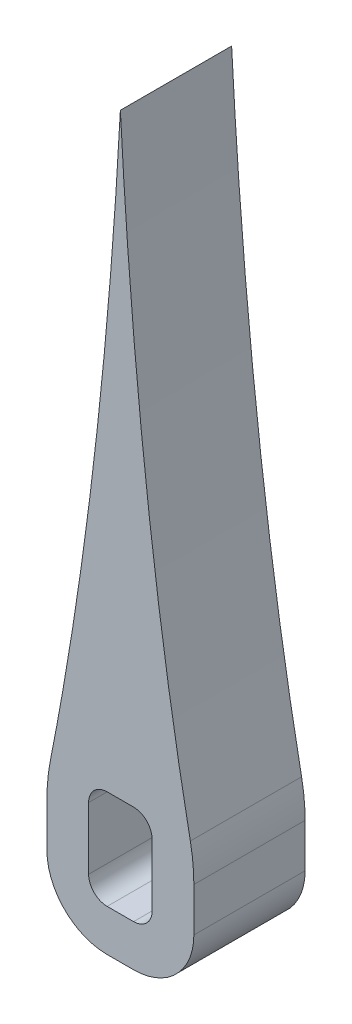
ISO-10303-21;
HEADER;
FILE_DESCRIPTION(('STEP AP214'),'2;1');
FILE_NAME('part.step','',(''),(''),'','','');
FILE_SCHEMA(('AUTOMOTIVE_DESIGN { 1 0 10303 214 1 1 1 1 }'));
ENDSEC;
DATA;
#1=APPLICATION_CONTEXT('core data for automotive mechanical design processes');
#2=APPLICATION_PROTOCOL_DEFINITION('international standard','automotive_design',2000,#1);
#3=PRODUCT_CONTEXT('',#1,'mechanical');
#4=PRODUCT('Part','Part','',(#3));
#5=PRODUCT_RELATED_PRODUCT_CATEGORY('part','',(#4));
#6=PRODUCT_DEFINITION_FORMATION('','',#4);
#7=PRODUCT_DEFINITION_CONTEXT('part definition',#1,'design');
#8=PRODUCT_DEFINITION('design','',#6,#7);
#9=PRODUCT_DEFINITION_SHAPE('','',#8);
#10=(LENGTH_UNIT() NAMED_UNIT(*) SI_UNIT(.MILLI.,.METRE.));
#11=(NAMED_UNIT(*) PLANE_ANGLE_UNIT() SI_UNIT($,.RADIAN.));
#12=(NAMED_UNIT(*) SI_UNIT($,.STERADIAN.) SOLID_ANGLE_UNIT());
#13=UNCERTAINTY_MEASURE_WITH_UNIT(LENGTH_MEASURE(1.E-05),#10,'distance_accuracy_value','');
#14=(GEOMETRIC_REPRESENTATION_CONTEXT(3) GLOBAL_UNCERTAINTY_ASSIGNED_CONTEXT((#13)) GLOBAL_UNIT_ASSIGNED_CONTEXT((#10,
#11,#12)) REPRESENTATION_CONTEXT('',''));
#15=CARTESIAN_POINT('',(0.,0.,0.));
#16=DIRECTION('',(0.,0.,1.));
#17=DIRECTION('',(1.,0.,0.));
#18=AXIS2_PLACEMENT_3D('',#15,#16,#17);
#19=CARTESIAN_POINT('',(-0.7239,-1.7018,6.096));
#20=DIRECTION('',(0.,0.,1.));
#21=DIRECTION('',(1.,0.,0.));
#22=AXIS2_PLACEMENT_3D('',#19,#20,#21);
#23=PLANE('',#22);
#24=CARTESIAN_POINT('',(-0.7239,-1.7018,6.096));
#25=DIRECTION('',(0.,0.,1.));
#26=DIRECTION('',(1.,0.,0.));
#27=AXIS2_PLACEMENT_3D('',#24,#25,#26);
#28=CIRCLE('',#27,3.302);
#29=CARTESIAN_POINT('',(-4.0259,-1.70179999999999,6.096));
#30=VERTEX_POINT('',#29);
#31=CARTESIAN_POINT('',(-0.723899999999977,-5.0038,6.096));
#32=VERTEX_POINT('',#31);
#33=EDGE_CURVE('E217',#30,#32,#28,.T.);
#34=ORIENTED_EDGE('',*,*,#33,.T.);
#35=DIRECTION('',(1.,0.,0.));
#36=VECTOR('',#35,1.);
#37=CARTESIAN_POINT('',(-0.723899999999977,-5.0038,6.096));
#38=LINE('',#37,#36);
#39=CARTESIAN_POINT('',(0.723899999999994,-5.0038,6.096));
#40=VERTEX_POINT('',#39);
#41=EDGE_CURVE('E220',#32,#40,#38,.T.);
#42=ORIENTED_EDGE('',*,*,#41,.T.);
#43=CARTESIAN_POINT('',(0.7239,-1.7018,6.096));
#44=DIRECTION('',(0.,0.,1.));
#45=DIRECTION('',(1.,0.,0.));
#46=AXIS2_PLACEMENT_3D('',#43,#44,#45);
#47=CIRCLE('',#46,3.302);
#48=CARTESIAN_POINT('',(4.0259,-1.70179999999998,6.096));
#49=VERTEX_POINT('',#48);
#50=EDGE_CURVE('E223',#40,#49,#47,.T.);
#51=ORIENTED_EDGE('',*,*,#50,.T.);
#52=DIRECTION('',(0.,1.,0.));
#53=VECTOR('',#52,1.);
#54=CARTESIAN_POINT('',(4.0259,0.692415094850239,6.096));
#55=LINE('',#54,#53);
#56=CARTESIAN_POINT('',(4.0259,0.692415094850239,6.096));
#57=VERTEX_POINT('',#56);
#58=EDGE_CURVE('E225',#49,#57,#55,.T.);
#59=ORIENTED_EDGE('',*,*,#58,.T.);
#60=CARTESIAN_POINT('',(-6.1341,0.692415094850229,6.096));
#61=DIRECTION('',(0.,0.,1.));
#62=DIRECTION('',(1.,0.,0.));
#63=AXIS2_PLACEMENT_3D('',#60,#61,#62);
#64=CIRCLE('',#63,10.16);
#65=CARTESIAN_POINT('',(3.83308577327428,2.66239168380725,6.096));
#66=VERTEX_POINT('',#65);
#67=EDGE_CURVE('E227',#57,#66,#64,.T.);
#68=ORIENTED_EDGE('',*,*,#67,.T.);
#69=CARTESIAN_POINT('',(3.83308577327428,2.66239168380725,6.096));
#70=CARTESIAN_POINT('',(2.88299314516387,7.46942836600891,6.096));
#71=CARTESIAN_POINT('',(1.2940528881847,17.7362711434614,6.096));
#72=CARTESIAN_POINT('',(0.327602629649656,29.3086527472857,6.096));
#73=CARTESIAN_POINT('',(0.,35.42122825575,6.096));
#74=B_SPLINE_CURVE_WITH_KNOTS('',3,(#69,#70,#71,#72,#73),.UNSPECIFIED.,.F.,.F.,(4,1,4),
(0.0323739223035085,0.516186961151754,1.),.UNSPECIFIED.);
#75=CARTESIAN_POINT('',(0.,35.42122825575,6.096));
#76=VERTEX_POINT('',#75);
#77=EDGE_CURVE('E229',#66,#76,#74,.T.);
#78=ORIENTED_EDGE('',*,*,#77,.T.);
#79=CARTESIAN_POINT('',(0.,35.42122825575,6.096));
#80=CARTESIAN_POINT('',(-0.327602629649657,29.3086527472857,6.096));
#81=CARTESIAN_POINT('',(-1.29405288818469,17.7362711434614,6.096));
#82=CARTESIAN_POINT('',(-2.88299314516388,7.46942836600891,6.096));
#83=CARTESIAN_POINT('',(-3.83308577327429,2.66239168380725,6.096));
#84=B_SPLINE_CURVE_WITH_KNOTS('',3,(#79,#80,#81,#82,#83),.UNSPECIFIED.,.F.,.F.,(4,1,4),
(0.0323739223035084,0.516186961151754,1.),.UNSPECIFIED.);
#85=CARTESIAN_POINT('',(-3.83308577327428,2.66239168380725,6.096));
#86=VERTEX_POINT('',#85);
#87=EDGE_CURVE('E234',#76,#86,#84,.T.);
#88=ORIENTED_EDGE('',*,*,#87,.T.);
#89=CARTESIAN_POINT('',(6.1341,0.692415094850239,6.096));
#90=DIRECTION('',(0.,0.,1.));
#91=DIRECTION('',(-1.,0.,0.));
#92=AXIS2_PLACEMENT_3D('',#89,#90,#91);
#93=CIRCLE('',#92,10.16);
#94=CARTESIAN_POINT('',(-4.0259,0.692415094850237,6.096));
#95=VERTEX_POINT('',#94);
#96=EDGE_CURVE('E367',#86,#95,#93,.T.);
#97=ORIENTED_EDGE('',*,*,#96,.T.);
#98=DIRECTION('',(0.,-1.,0.));
#99=VECTOR('',#98,1.);
#100=CARTESIAN_POINT('',(-4.0259,0.692415094850237,6.096));
#101=LINE('',#100,#99);
#102=EDGE_CURVE('E306',#95,#30,#101,.T.);
#103=ORIENTED_EDGE('',*,*,#102,.T.);
#104=EDGE_LOOP('',(#34,#42,#51,#59,#68,#78,#88,#97,#103));
#105=FACE_BOUND('',#104,.T.);
#106=DIRECTION('',(0.,-1.,0.));
#107=VECTOR('',#106,1.);
#108=CARTESIAN_POINT('',(-1.7399,1.7018,6.096));
#109=LINE('',#108,#107);
#110=CARTESIAN_POINT('',(-1.7399,1.7018,6.096));
#111=VERTEX_POINT('',#110);
#112=CARTESIAN_POINT('',(-1.7399,-1.70179999999999,6.096));
#113=VERTEX_POINT('',#112);
#114=EDGE_CURVE('E160',#111,#113,#109,.T.);
#115=ORIENTED_EDGE('',*,*,#114,.F.);
#116=CARTESIAN_POINT('',(-0.7239,1.7018,6.096));
#117=DIRECTION('',(0.,0.,1.));
#118=DIRECTION('',(1.,0.,0.));
#119=AXIS2_PLACEMENT_3D('',#116,#117,#118);
#120=CIRCLE('',#119,1.016);
#121=CARTESIAN_POINT('',(-0.723899999999995,2.7178,6.096));
#122=VERTEX_POINT('',#121);
#123=EDGE_CURVE('E152',#122,#111,#120,.T.);
#124=ORIENTED_EDGE('',*,*,#123,.F.);
#125=DIRECTION('',(-1.,0.,0.));
#126=VECTOR('',#125,1.);
#127=CARTESIAN_POINT('',(-0.723899999999995,2.7178,6.096));
#128=LINE('',#127,#126);
#129=CARTESIAN_POINT('',(0.723899999999993,2.7178,6.096));
#130=VERTEX_POINT('',#129);
#131=EDGE_CURVE('E185',#130,#122,#128,.T.);
#132=ORIENTED_EDGE('',*,*,#131,.F.);
#133=CARTESIAN_POINT('',(0.7239,1.7018,6.096));
#134=DIRECTION('',(0.,0.,1.));
#135=DIRECTION('',(-1.,0.,0.));
#136=AXIS2_PLACEMENT_3D('',#133,#134,#135);
#137=CIRCLE('',#136,1.016);
#138=CARTESIAN_POINT('',(1.7399,1.7018,6.096));
#139=VERTEX_POINT('',#138);
#140=EDGE_CURVE('E183',#139,#130,#137,.T.);
#141=ORIENTED_EDGE('',*,*,#140,.F.);
#142=DIRECTION('',(0.,1.,0.));
#143=VECTOR('',#142,1.);
#144=CARTESIAN_POINT('',(1.7399,1.7018,6.096));
#145=LINE('',#144,#143);
#146=CARTESIAN_POINT('',(1.7399,-1.7018,6.096));
#147=VERTEX_POINT('',#146);
#148=EDGE_CURVE('E181',#147,#139,#145,.T.);
#149=ORIENTED_EDGE('',*,*,#148,.F.);
#150=CARTESIAN_POINT('',(0.7239,-1.7018,6.096));
#151=DIRECTION('',(0.,0.,1.));
#152=DIRECTION('',(1.,0.,0.));
#153=AXIS2_PLACEMENT_3D('',#150,#151,#152);
#154=CIRCLE('',#153,1.016);
#155=CARTESIAN_POINT('',(0.723899999999995,-2.7178,6.096));
#156=VERTEX_POINT('',#155);
#157=EDGE_CURVE('E179',#156,#147,#154,.T.);
#158=ORIENTED_EDGE('',*,*,#157,.F.);
#159=DIRECTION('',(1.,0.,0.));
#160=VECTOR('',#159,1.);
#161=CARTESIAN_POINT('',(-0.723899999999993,-2.7178,6.096));
#162=LINE('',#161,#160);
#163=CARTESIAN_POINT('',(-0.723899999999993,-2.7178,6.096));
#164=VERTEX_POINT('',#163);
#165=EDGE_CURVE('E175',#164,#156,#162,.T.);
#166=ORIENTED_EDGE('',*,*,#165,.F.);
#167=CARTESIAN_POINT('',(-0.7239,-1.7018,6.096));
#168=DIRECTION('',(0.,0.,1.));
#169=DIRECTION('',(1.,0.,0.));
#170=AXIS2_PLACEMENT_3D('',#167,#168,#169);
#171=CIRCLE('',#170,1.016);
#172=EDGE_CURVE('E173',#113,#164,#171,.T.);
#173=ORIENTED_EDGE('',*,*,#172,.F.);
#174=EDGE_LOOP('',(#115,#124,#132,#141,#149,#158,#166,#173));
#175=FACE_BOUND('',#174,.T.);
#176=ADVANCED_FACE('F33',(#105,#175),#23,.T.);
#177=CARTESIAN_POINT('',(-0.7239,-1.7018,0.));
#178=DIRECTION('',(0.,0.,1.));
#179=DIRECTION('',(1.,0.,0.));
#180=AXIS2_PLACEMENT_3D('',#177,#178,#179);
#181=PLANE('',#180);
#182=CARTESIAN_POINT('',(-0.7239,-1.7018,0.));
#183=DIRECTION('',(0.,0.,1.));
#184=DIRECTION('',(1.,0.,0.));
#185=AXIS2_PLACEMENT_3D('',#182,#183,#184);
#186=CIRCLE('',#185,3.302);
#187=CARTESIAN_POINT('',(-4.0259,-1.70179999999999,0.));
#188=VERTEX_POINT('',#187);
#189=CARTESIAN_POINT('',(-0.723899999999977,-5.0038,0.));
#190=VERTEX_POINT('',#189);
#191=EDGE_CURVE('E168',#188,#190,#186,.T.);
#192=ORIENTED_EDGE('',*,*,#191,.F.);
#193=DIRECTION('',(0.,-1.,0.));
#194=VECTOR('',#193,1.);
#195=CARTESIAN_POINT('',(-4.0259,0.692415094850237,0.));
#196=LINE('',#195,#194);
#197=CARTESIAN_POINT('',(-4.0259,0.692415094850237,0.));
#198=VERTEX_POINT('',#197);
#199=EDGE_CURVE('E221',#198,#188,#196,.T.);
#200=ORIENTED_EDGE('',*,*,#199,.F.);
#201=CARTESIAN_POINT('',(6.1341,0.692415094850239,0.));
#202=DIRECTION('',(0.,0.,1.));
#203=DIRECTION('',(-1.,0.,0.));
#204=AXIS2_PLACEMENT_3D('',#201,#202,#203);
#205=CIRCLE('',#204,10.16);
#206=CARTESIAN_POINT('',(-3.83308577327428,2.66239168380725,0.));
#207=VERTEX_POINT('',#206);
#208=EDGE_CURVE('E293',#207,#198,#205,.T.);
#209=ORIENTED_EDGE('',*,*,#208,.F.);
#210=CARTESIAN_POINT('',(0.,35.42122825575,0.));
#211=CARTESIAN_POINT('',(-0.327602629649657,29.3086527472857,0.));
#212=CARTESIAN_POINT('',(-1.29405288818469,17.7362711434614,0.));
#213=CARTESIAN_POINT('',(-2.88299314516388,7.46942836600891,0.));
#214=CARTESIAN_POINT('',(-3.83308577327429,2.66239168380725,0.));
#215=B_SPLINE_CURVE_WITH_KNOTS('',3,(#210,#211,#212,#213,#214),.UNSPECIFIED.,.F.,.F.,(4,1,4),
(0.0323739223035084,0.516186961151754,1.),.UNSPECIFIED.);
#216=CARTESIAN_POINT('',(0.,35.42122825575,0.));
#217=VERTEX_POINT('',#216);
#218=EDGE_CURVE('E302',#217,#207,#215,.T.);
#219=ORIENTED_EDGE('',*,*,#218,.F.);
#220=CARTESIAN_POINT('',(3.83308577327428,2.66239168380725,0.));
#221=CARTESIAN_POINT('',(2.88299314516387,7.46942836600891,0.));
#222=CARTESIAN_POINT('',(1.2940528881847,17.7362711434614,0.));
#223=CARTESIAN_POINT('',(0.327602629649656,29.3086527472857,0.));
#224=CARTESIAN_POINT('',(0.,35.42122825575,0.));
#225=B_SPLINE_CURVE_WITH_KNOTS('',3,(#220,#221,#222,#223,#224),.UNSPECIFIED.,.F.,.F.,(4,1,4),
(0.0323739223035085,0.516186961151754,1.),.UNSPECIFIED.);
#226=CARTESIAN_POINT('',(3.83308577327428,2.66239168380725,0.));
#227=VERTEX_POINT('',#226);
#228=EDGE_CURVE('E345',#227,#217,#225,.T.);
#229=ORIENTED_EDGE('',*,*,#228,.F.);
#230=CARTESIAN_POINT('',(-6.1341,0.692415094850229,0.));
#231=DIRECTION('',(0.,0.,1.));
#232=DIRECTION('',(1.,0.,0.));
#233=AXIS2_PLACEMENT_3D('',#230,#231,#232);
#234=CIRCLE('',#233,10.16);
#235=CARTESIAN_POINT('',(4.0259,0.692415094850239,0.));
#236=VERTEX_POINT('',#235);
#237=EDGE_CURVE('E339',#236,#227,#234,.T.);
#238=ORIENTED_EDGE('',*,*,#237,.F.);
#239=DIRECTION('',(0.,1.,0.));
#240=VECTOR('',#239,1.);
#241=CARTESIAN_POINT('',(4.0259,0.692415094850239,0.));
#242=LINE('',#241,#240);
#243=CARTESIAN_POINT('',(4.0259,-1.70179999999998,0.));
#244=VERTEX_POINT('',#243);
#245=EDGE_CURVE('E337',#244,#236,#242,.T.);
#246=ORIENTED_EDGE('',*,*,#245,.F.);
#247=CARTESIAN_POINT('',(0.7239,-1.7018,0.));
#248=DIRECTION('',(0.,0.,1.));
#249=DIRECTION('',(1.,0.,0.));
#250=AXIS2_PLACEMENT_3D('',#247,#248,#249);
#251=CIRCLE('',#250,3.302);
#252=CARTESIAN_POINT('',(0.723899999999994,-5.0038,0.));
#253=VERTEX_POINT('',#252);
#254=EDGE_CURVE('E333',#253,#244,#251,.T.);
#255=ORIENTED_EDGE('',*,*,#254,.F.);
#256=DIRECTION('',(1.,0.,0.));
#257=VECTOR('',#256,1.);
#258=CARTESIAN_POINT('',(-0.723899999999977,-5.0038,0.));
#259=LINE('',#258,#257);
#260=EDGE_CURVE('E335',#190,#253,#259,.T.);
#261=ORIENTED_EDGE('',*,*,#260,.F.);
#262=EDGE_LOOP('',(#192,#200,#209,#219,#229,#238,#246,#255,#261));
#263=FACE_BOUND('',#262,.T.);
#264=CARTESIAN_POINT('',(-0.7239,1.7018,0.));
#265=DIRECTION('',(0.,0.,1.));
#266=DIRECTION('',(1.,0.,0.));
#267=AXIS2_PLACEMENT_3D('',#264,#265,#266);
#268=CIRCLE('',#267,1.016);
#269=CARTESIAN_POINT('',(-0.723899999999995,2.7178,0.));
#270=VERTEX_POINT('',#269);
#271=CARTESIAN_POINT('',(-1.7399,1.7018,0.));
#272=VERTEX_POINT('',#271);
#273=EDGE_CURVE('E56',#270,#272,#268,.T.);
#274=ORIENTED_EDGE('',*,*,#273,.T.);
#275=DIRECTION('',(0.,-1.,0.));
#276=VECTOR('',#275,1.);
#277=CARTESIAN_POINT('',(-1.7399,1.7018,0.));
#278=LINE('',#277,#276);
#279=CARTESIAN_POINT('',(-1.7399,-1.70179999999999,0.));
#280=VERTEX_POINT('',#279);
#281=EDGE_CURVE('E167',#272,#280,#278,.T.);
#282=ORIENTED_EDGE('',*,*,#281,.T.);
#283=CARTESIAN_POINT('',(-0.7239,-1.7018,0.));
#284=DIRECTION('',(0.,0.,1.));
#285=DIRECTION('',(1.,0.,0.));
#286=AXIS2_PLACEMENT_3D('',#283,#284,#285);
#287=CIRCLE('',#286,1.016);
#288=CARTESIAN_POINT('',(-0.723899999999993,-2.7178,0.));
#289=VERTEX_POINT('',#288);
#290=EDGE_CURVE('E189',#280,#289,#287,.T.);
#291=ORIENTED_EDGE('',*,*,#290,.T.);
#292=DIRECTION('',(1.,0.,0.));
#293=VECTOR('',#292,1.);
#294=CARTESIAN_POINT('',(-0.723899999999993,-2.7178,0.));
#295=LINE('',#294,#293);
#296=CARTESIAN_POINT('',(0.723899999999995,-2.7178,0.));
#297=VERTEX_POINT('',#296);
#298=EDGE_CURVE('E192',#289,#297,#295,.T.);
#299=ORIENTED_EDGE('',*,*,#298,.T.);
#300=CARTESIAN_POINT('',(0.7239,-1.7018,0.));
#301=DIRECTION('',(0.,0.,1.));
#302=DIRECTION('',(1.,0.,0.));
#303=AXIS2_PLACEMENT_3D('',#300,#301,#302);
#304=CIRCLE('',#303,1.016);
#305=CARTESIAN_POINT('',(1.7399,-1.7018,0.));
#306=VERTEX_POINT('',#305);
#307=EDGE_CURVE('E195',#297,#306,#304,.T.);
#308=ORIENTED_EDGE('',*,*,#307,.T.);
#309=DIRECTION('',(0.,1.,0.));
#310=VECTOR('',#309,1.);
#311=CARTESIAN_POINT('',(1.7399,1.7018,0.));
#312=LINE('',#311,#310);
#313=CARTESIAN_POINT('',(1.7399,1.7018,0.));
#314=VERTEX_POINT('',#313);
#315=EDGE_CURVE('E198',#306,#314,#312,.T.);
#316=ORIENTED_EDGE('',*,*,#315,.T.);
#317=CARTESIAN_POINT('',(0.7239,1.7018,0.));
#318=DIRECTION('',(0.,0.,1.));
#319=DIRECTION('',(-1.,0.,0.));
#320=AXIS2_PLACEMENT_3D('',#317,#318,#319);
#321=CIRCLE('',#320,1.016);
#322=CARTESIAN_POINT('',(0.723899999999993,2.7178,0.));
#323=VERTEX_POINT('',#322);
#324=EDGE_CURVE('E201',#314,#323,#321,.T.);
#325=ORIENTED_EDGE('',*,*,#324,.T.);
#326=DIRECTION('',(-1.,0.,0.));
#327=VECTOR('',#326,1.);
#328=CARTESIAN_POINT('',(-0.723899999999995,2.7178,0.));
#329=LINE('',#328,#327);
#330=EDGE_CURVE('E161',#323,#270,#329,.T.);
#331=ORIENTED_EDGE('',*,*,#330,.T.);
#332=EDGE_LOOP('',(#274,#282,#291,#299,#308,#316,#325,#331));
#333=FACE_BOUND('',#332,.T.);
#334=ADVANCED_FACE('F267',(#263,#333),#181,.F.);
#335=CARTESIAN_POINT('',(-0.7239,-1.7018,6.096));
#336=DIRECTION('',(0.,0.,-1.));
#337=DIRECTION('',(-1.,0.,0.));
#338=AXIS2_PLACEMENT_3D('',#335,#336,#337);
#339=CYLINDRICAL_SURFACE('',#338,3.302);
#340=ORIENTED_EDGE('',*,*,#191,.T.);
#341=DIRECTION('',(0.,0.,-1.));
#342=VECTOR('',#341,1.);
#343=CARTESIAN_POINT('',(-0.723899999999977,-5.0038,6.096));
#344=LINE('',#343,#342);
#345=EDGE_CURVE('E11',#32,#190,#344,.T.);
#346=ORIENTED_EDGE('',*,*,#345,.F.);
#347=ORIENTED_EDGE('',*,*,#33,.F.);
#348=DIRECTION('',(0.,0.,-1.));
#349=VECTOR('',#348,1.);
#350=CARTESIAN_POINT('',(-4.0259,-1.70179999999999,6.096));
#351=LINE('',#350,#349);
#352=EDGE_CURVE('E307',#30,#188,#351,.T.);
#353=ORIENTED_EDGE('',*,*,#352,.T.);
#354=EDGE_LOOP('',(#340,#346,#347,#353));
#355=FACE_BOUND('',#354,.T.);
#356=ADVANCED_FACE('F35',(#355),#339,.T.);
#357=CARTESIAN_POINT('',(-0.723899999999977,-5.0038,6.096));
#358=DIRECTION('',(0.,1.,0.));
#359=DIRECTION('',(0.,0.,1.));
#360=AXIS2_PLACEMENT_3D('',#357,#358,#359);
#361=PLANE('',#360);
#362=ORIENTED_EDGE('',*,*,#260,.T.);
#363=DIRECTION('',(0.,0.,-1.));
#364=VECTOR('',#363,1.);
#365=CARTESIAN_POINT('',(0.723899999999994,-5.0038,6.096));
#366=LINE('',#365,#364);
#367=EDGE_CURVE('E41',#40,#253,#366,.T.);
#368=ORIENTED_EDGE('',*,*,#367,.F.);
#369=ORIENTED_EDGE('',*,*,#41,.F.);
#370=ORIENTED_EDGE('',*,*,#345,.T.);
#371=EDGE_LOOP('',(#362,#368,#369,#370));
#372=FACE_BOUND('',#371,.T.);
#373=ADVANCED_FACE('F260',(#372),#361,.F.);
#374=CARTESIAN_POINT('',(0.7239,-1.7018,6.096));
#375=DIRECTION('',(0.,0.,-1.));
#376=DIRECTION('',(-1.,0.,0.));
#377=AXIS2_PLACEMENT_3D('',#374,#375,#376);
#378=CYLINDRICAL_SURFACE('',#377,3.302);
#379=ORIENTED_EDGE('',*,*,#254,.T.);
#380=DIRECTION('',(0.,0.,-1.));
#381=VECTOR('',#380,1.);
#382=CARTESIAN_POINT('',(4.0259,-1.70179999999998,6.096));
#383=LINE('',#382,#381);
#384=EDGE_CURVE('E326',#49,#244,#383,.T.);
#385=ORIENTED_EDGE('',*,*,#384,.F.);
#386=ORIENTED_EDGE('',*,*,#50,.F.);
#387=ORIENTED_EDGE('',*,*,#367,.T.);
#388=EDGE_LOOP('',(#379,#385,#386,#387));
#389=FACE_BOUND('',#388,.T.);
#390=ADVANCED_FACE('F257',(#389),#378,.T.);
#391=CARTESIAN_POINT('',(4.0259,0.692415094850239,6.096));
#392=DIRECTION('',(-1.,0.,0.));
#393=DIRECTION('',(0.,-1.,0.));
#394=AXIS2_PLACEMENT_3D('',#391,#392,#393);
#395=PLANE('',#394);
#396=ORIENTED_EDGE('',*,*,#245,.T.);
#397=DIRECTION('',(0.,0.,-1.));
#398=VECTOR('',#397,1.);
#399=CARTESIAN_POINT('',(4.0259,0.692415094850239,6.096));
#400=LINE('',#399,#398);
#401=EDGE_CURVE('E323',#57,#236,#400,.T.);
#402=ORIENTED_EDGE('',*,*,#401,.F.);
#403=ORIENTED_EDGE('',*,*,#58,.F.);
#404=ORIENTED_EDGE('',*,*,#384,.T.);
#405=EDGE_LOOP('',(#396,#402,#403,#404));
#406=FACE_BOUND('',#405,.T.);
#407=ADVANCED_FACE('F253',(#406),#395,.F.);
#408=CARTESIAN_POINT('',(-6.1341,0.692415094850229,6.096));
#409=DIRECTION('',(0.,0.,-1.));
#410=DIRECTION('',(-1.,0.,0.));
#411=AXIS2_PLACEMENT_3D('',#408,#409,#410);
#412=CYLINDRICAL_SURFACE('',#411,10.16);
#413=ORIENTED_EDGE('',*,*,#237,.T.);
#414=DIRECTION('',(0.,0.,-1.));
#415=VECTOR('',#414,1.);
#416=CARTESIAN_POINT('',(3.83308577327428,2.66239168380725,6.096));
#417=LINE('',#416,#415);
#418=EDGE_CURVE('E320',#66,#227,#417,.T.);
#419=ORIENTED_EDGE('',*,*,#418,.F.);
#420=ORIENTED_EDGE('',*,*,#67,.F.);
#421=ORIENTED_EDGE('',*,*,#401,.T.);
#422=EDGE_LOOP('',(#413,#419,#420,#421));
#423=FACE_BOUND('',#422,.T.);
#424=ADVANCED_FACE('F248',(#423),#412,.T.);
#425=DIRECTION('',(0.,0.,-1.));
#426=VECTOR('',#425,1.);
#427=SURFACE_OF_LINEAR_EXTRUSION('',#74,#426);
#428=ORIENTED_EDGE('',*,*,#228,.T.);
#429=DIRECTION('',(0.,0.,-1.));
#430=VECTOR('',#429,1.);
#431=CARTESIAN_POINT('',(0.,35.42122825575,6.096));
#432=LINE('',#431,#430);
#433=EDGE_CURVE('E317',#76,#217,#432,.T.);
#434=ORIENTED_EDGE('',*,*,#433,.F.);
#435=ORIENTED_EDGE('',*,*,#77,.F.);
#436=ORIENTED_EDGE('',*,*,#418,.T.);
#437=EDGE_LOOP('',(#428,#434,#435,#436));
#438=FACE_BOUND('',#437,.T.);
#439=ADVANCED_FACE('F243',(#438),#427,.F.);
#440=DIRECTION('',(0.,0.,-1.));
#441=VECTOR('',#440,1.);
#442=SURFACE_OF_LINEAR_EXTRUSION('',#84,#441);
#443=ORIENTED_EDGE('',*,*,#218,.T.);
#444=DIRECTION('',(0.,0.,-1.));
#445=VECTOR('',#444,1.);
#446=CARTESIAN_POINT('',(-3.83308577327428,2.66239168380725,6.096));
#447=LINE('',#446,#445);
#448=EDGE_CURVE('E299',#86,#207,#447,.T.);
#449=ORIENTED_EDGE('',*,*,#448,.F.);
#450=ORIENTED_EDGE('',*,*,#87,.F.);
#451=ORIENTED_EDGE('',*,*,#433,.T.);
#452=EDGE_LOOP('',(#443,#449,#450,#451));
#453=FACE_BOUND('',#452,.T.);
#454=ADVANCED_FACE('F247',(#453),#442,.F.);
#455=CARTESIAN_POINT('',(6.1341,0.692415094850239,6.096));
#456=DIRECTION('',(0.,0.,-1.));
#457=DIRECTION('',(-1.,0.,0.));
#458=AXIS2_PLACEMENT_3D('',#455,#456,#457);
#459=CYLINDRICAL_SURFACE('',#458,10.16);
#460=ORIENTED_EDGE('',*,*,#208,.T.);
#461=DIRECTION('',(0.,0.,-1.));
#462=VECTOR('',#461,1.);
#463=CARTESIAN_POINT('',(-4.0259,0.692415094850237,6.096));
#464=LINE('',#463,#462);
#465=EDGE_CURVE('E296',#95,#198,#464,.T.);
#466=ORIENTED_EDGE('',*,*,#465,.F.);
#467=ORIENTED_EDGE('',*,*,#96,.F.);
#468=ORIENTED_EDGE('',*,*,#448,.T.);
#469=EDGE_LOOP('',(#460,#466,#467,#468));
#470=FACE_BOUND('',#469,.T.);
#471=ADVANCED_FACE('F282',(#470),#459,.T.);
#472=CARTESIAN_POINT('',(-4.0259,0.692415094850237,6.096));
#473=DIRECTION('',(1.,0.,0.));
#474=DIRECTION('',(0.,0.,-1.));
#475=AXIS2_PLACEMENT_3D('',#472,#473,#474);
#476=PLANE('',#475);
#477=ORIENTED_EDGE('',*,*,#199,.T.);
#478=ORIENTED_EDGE('',*,*,#352,.F.);
#479=ORIENTED_EDGE('',*,*,#102,.F.);
#480=ORIENTED_EDGE('',*,*,#465,.T.);
#481=EDGE_LOOP('',(#477,#478,#479,#480));
#482=FACE_BOUND('',#481,.T.);
#483=ADVANCED_FACE('F280',(#482),#476,.F.);
#484=CARTESIAN_POINT('',(-0.7239,1.7018,6.096));
#485=DIRECTION('',(0.,0.,-1.));
#486=DIRECTION('',(-1.,0.,0.));
#487=AXIS2_PLACEMENT_3D('',#484,#485,#486);
#488=CYLINDRICAL_SURFACE('',#487,1.016);
#489=ORIENTED_EDGE('',*,*,#273,.F.);
#490=DIRECTION('',(0.,0.,-1.));
#491=VECTOR('',#490,1.);
#492=CARTESIAN_POINT('',(-0.723899999999995,2.7178,6.096));
#493=LINE('',#492,#491);
#494=EDGE_CURVE('E156',#122,#270,#493,.T.);
#495=ORIENTED_EDGE('',*,*,#494,.F.);
#496=ORIENTED_EDGE('',*,*,#123,.T.);
#497=DIRECTION('',(0.,0.,-1.));
#498=VECTOR('',#497,1.);
#499=CARTESIAN_POINT('',(-1.7399,1.7018,6.096));
#500=LINE('',#499,#498);
#501=EDGE_CURVE('E155',#111,#272,#500,.T.);
#502=ORIENTED_EDGE('',*,*,#501,.T.);
#503=EDGE_LOOP('',(#489,#495,#496,#502));
#504=FACE_BOUND('',#503,.T.);
#505=ADVANCED_FACE('F154',(#504),#488,.F.);
#506=CARTESIAN_POINT('',(-1.7399,1.7018,6.096));
#507=DIRECTION('',(1.,0.,0.));
#508=DIRECTION('',(0.,0.,-1.));
#509=AXIS2_PLACEMENT_3D('',#506,#507,#508);
#510=PLANE('',#509);
#511=ORIENTED_EDGE('',*,*,#281,.F.);
#512=ORIENTED_EDGE('',*,*,#501,.F.);
#513=ORIENTED_EDGE('',*,*,#114,.T.);
#514=DIRECTION('',(0.,0.,-1.));
#515=VECTOR('',#514,1.);
#516=CARTESIAN_POINT('',(-1.7399,-1.70179999999999,6.096));
#517=LINE('',#516,#515);
#518=EDGE_CURVE('E169',#113,#280,#517,.T.);
#519=ORIENTED_EDGE('',*,*,#518,.T.);
#520=EDGE_LOOP('',(#511,#512,#513,#519));
#521=FACE_BOUND('',#520,.T.);
#522=ADVANCED_FACE('F164',(#521),#510,.T.);
#523=CARTESIAN_POINT('',(-0.7239,-1.7018,6.096));
#524=DIRECTION('',(0.,0.,-1.));
#525=DIRECTION('',(-1.,0.,0.));
#526=AXIS2_PLACEMENT_3D('',#523,#524,#525);
#527=CYLINDRICAL_SURFACE('',#526,1.016);
#528=ORIENTED_EDGE('',*,*,#290,.F.);
#529=ORIENTED_EDGE('',*,*,#518,.F.);
#530=ORIENTED_EDGE('',*,*,#172,.T.);
#531=DIRECTION('',(0.,0.,-1.));
#532=VECTOR('',#531,1.);
#533=CARTESIAN_POINT('',(-0.723899999999993,-2.7178,6.096));
#534=LINE('',#533,#532);
#535=EDGE_CURVE('E214',#164,#289,#534,.T.);
#536=ORIENTED_EDGE('',*,*,#535,.T.);
#537=EDGE_LOOP('',(#528,#529,#530,#536));
#538=FACE_BOUND('',#537,.T.);
#539=ADVANCED_FACE('F390',(#538),#527,.F.);
#540=CARTESIAN_POINT('',(-0.723899999999993,-2.7178,6.096));
#541=DIRECTION('',(0.,1.,0.));
#542=DIRECTION('',(0.,0.,1.));
#543=AXIS2_PLACEMENT_3D('',#540,#541,#542);
#544=PLANE('',#543);
#545=ORIENTED_EDGE('',*,*,#298,.F.);
#546=ORIENTED_EDGE('',*,*,#535,.F.);
#547=ORIENTED_EDGE('',*,*,#165,.T.);
#548=DIRECTION('',(0.,0.,-1.));
#549=VECTOR('',#548,1.);
#550=CARTESIAN_POINT('',(0.723899999999995,-2.7178,6.096));
#551=LINE('',#550,#549);
#552=EDGE_CURVE('E212',#156,#297,#551,.T.);
#553=ORIENTED_EDGE('',*,*,#552,.T.);
#554=EDGE_LOOP('',(#545,#546,#547,#553));
#555=FACE_BOUND('',#554,.T.);
#556=ADVANCED_FACE('F387',(#555),#544,.T.);
#557=CARTESIAN_POINT('',(0.7239,-1.7018,6.096));
#558=DIRECTION('',(0.,0.,-1.));
#559=DIRECTION('',(-1.,0.,0.));
#560=AXIS2_PLACEMENT_3D('',#557,#558,#559);
#561=CYLINDRICAL_SURFACE('',#560,1.016);
#562=ORIENTED_EDGE('',*,*,#307,.F.);
#563=ORIENTED_EDGE('',*,*,#552,.F.);
#564=ORIENTED_EDGE('',*,*,#157,.T.);
#565=DIRECTION('',(0.,0.,-1.));
#566=VECTOR('',#565,1.);
#567=CARTESIAN_POINT('',(1.7399,-1.7018,6.096));
#568=LINE('',#567,#566);
#569=EDGE_CURVE('E210',#147,#306,#568,.T.);
#570=ORIENTED_EDGE('',*,*,#569,.T.);
#571=EDGE_LOOP('',(#562,#563,#564,#570));
#572=FACE_BOUND('',#571,.T.);
#573=ADVANCED_FACE('F382',(#572),#561,.F.);
#574=CARTESIAN_POINT('',(1.7399,1.7018,6.096));
#575=DIRECTION('',(-1.,0.,0.));
#576=DIRECTION('',(0.,-1.,0.));
#577=AXIS2_PLACEMENT_3D('',#574,#575,#576);
#578=PLANE('',#577);
#579=ORIENTED_EDGE('',*,*,#315,.F.);
#580=ORIENTED_EDGE('',*,*,#569,.F.);
#581=ORIENTED_EDGE('',*,*,#148,.T.);
#582=DIRECTION('',(0.,0.,-1.));
#583=VECTOR('',#582,1.);
#584=CARTESIAN_POINT('',(1.7399,1.7018,6.096));
#585=LINE('',#584,#583);
#586=EDGE_CURVE('E208',#139,#314,#585,.T.);
#587=ORIENTED_EDGE('',*,*,#586,.T.);
#588=EDGE_LOOP('',(#579,#580,#581,#587));
#589=FACE_BOUND('',#588,.T.);
#590=ADVANCED_FACE('F378',(#589),#578,.T.);
#591=CARTESIAN_POINT('',(0.7239,1.7018,6.096));
#592=DIRECTION('',(0.,0.,-1.));
#593=DIRECTION('',(-1.,0.,0.));
#594=AXIS2_PLACEMENT_3D('',#591,#592,#593);
#595=CYLINDRICAL_SURFACE('',#594,1.016);
#596=ORIENTED_EDGE('',*,*,#324,.F.);
#597=ORIENTED_EDGE('',*,*,#586,.F.);
#598=ORIENTED_EDGE('',*,*,#140,.T.);
#599=DIRECTION('',(0.,0.,-1.));
#600=VECTOR('',#599,1.);
#601=CARTESIAN_POINT('',(0.723899999999993,2.7178,6.096));
#602=LINE('',#601,#600);
#603=EDGE_CURVE('E48',#130,#323,#602,.T.);
#604=ORIENTED_EDGE('',*,*,#603,.T.);
#605=EDGE_LOOP('',(#596,#597,#598,#604));
#606=FACE_BOUND('',#605,.T.);
#607=ADVANCED_FACE('F375',(#606),#595,.F.);
#608=CARTESIAN_POINT('',(-0.723899999999995,2.7178,6.096));
#609=DIRECTION('',(0.,-1.,0.));
#610=DIRECTION('',(0.,0.,-1.));
#611=AXIS2_PLACEMENT_3D('',#608,#609,#610);
#612=PLANE('',#611);
#613=ORIENTED_EDGE('',*,*,#330,.F.);
#614=ORIENTED_EDGE('',*,*,#603,.F.);
#615=ORIENTED_EDGE('',*,*,#131,.T.);
#616=ORIENTED_EDGE('',*,*,#494,.T.);
#617=EDGE_LOOP('',(#613,#614,#615,#616));
#618=FACE_BOUND('',#617,.T.);
#619=ADVANCED_FACE('F369',(#618),#612,.T.);
#620=CLOSED_SHELL('',(#176,#334,#356,#373,#390,#407,#424,#439,#454,#471,#483,#505,#522,#539,
#556,#573,#590,#607,#619));
#621=MANIFOLD_SOLID_BREP('B2',#620);
#622=ADVANCED_BREP_SHAPE_REPRESENTATION('',(#18,#621),#14);
#623=SHAPE_DEFINITION_REPRESENTATION(#9,#622);
ENDSEC;
END-ISO-10303-21;
